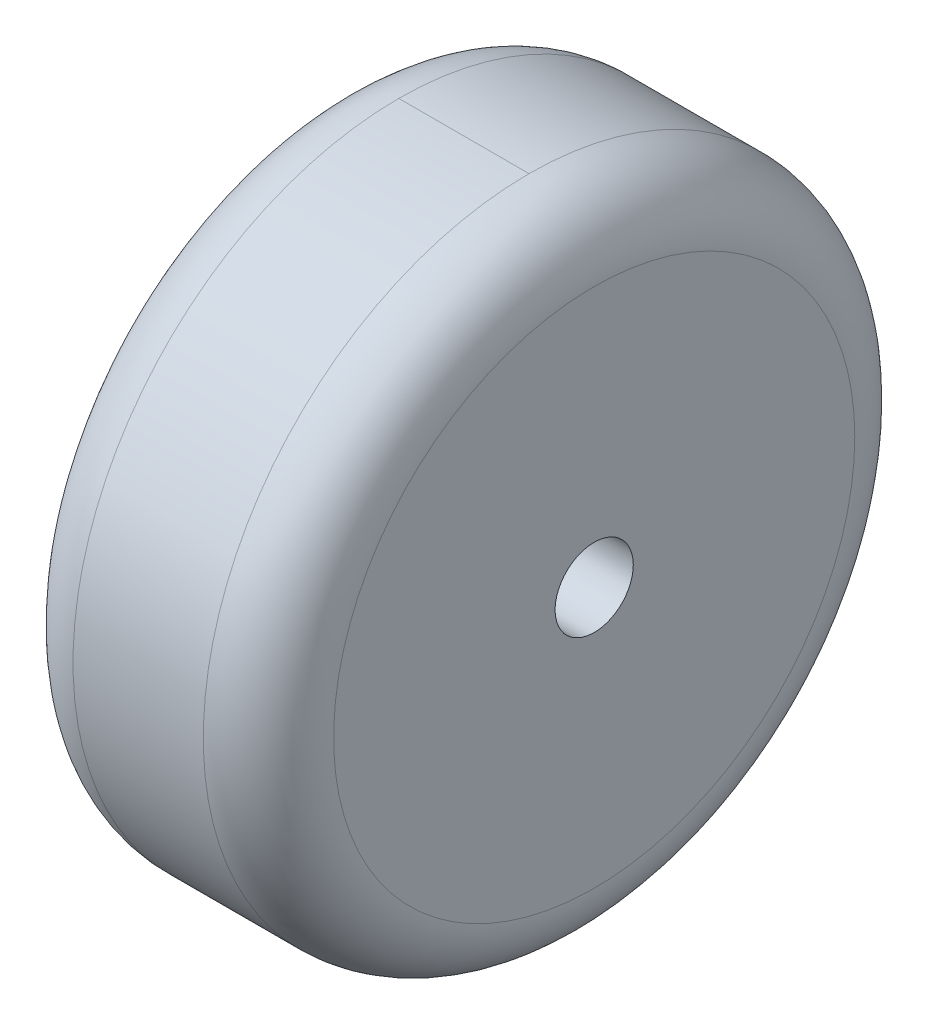
ISO-10303-21;
HEADER;
FILE_DESCRIPTION(('STEP AP214'),'2;1');
FILE_NAME('part.step','',(''),(''),'','','');
FILE_SCHEMA(('AUTOMOTIVE_DESIGN { 1 0 10303 214 1 1 1 1 }'));
ENDSEC;
DATA;
#1=APPLICATION_CONTEXT('core data for automotive mechanical design processes');
#2=APPLICATION_PROTOCOL_DEFINITION('international standard','automotive_design',2000,#1);
#3=PRODUCT_CONTEXT('',#1,'mechanical');
#4=PRODUCT('Part','Part','',(#3));
#5=PRODUCT_RELATED_PRODUCT_CATEGORY('part','',(#4));
#6=PRODUCT_DEFINITION_FORMATION('','',#4);
#7=PRODUCT_DEFINITION_CONTEXT('part definition',#1,'design');
#8=PRODUCT_DEFINITION('design','',#6,#7);
#9=PRODUCT_DEFINITION_SHAPE('','',#8);
#10=(LENGTH_UNIT() NAMED_UNIT(*) SI_UNIT(.MILLI.,.METRE.));
#11=(NAMED_UNIT(*) PLANE_ANGLE_UNIT() SI_UNIT($,.RADIAN.));
#12=(NAMED_UNIT(*) SI_UNIT($,.STERADIAN.) SOLID_ANGLE_UNIT());
#13=UNCERTAINTY_MEASURE_WITH_UNIT(LENGTH_MEASURE(1.E-05),#10,'distance_accuracy_value','');
#14=(GEOMETRIC_REPRESENTATION_CONTEXT(3) GLOBAL_UNCERTAINTY_ASSIGNED_CONTEXT((#13)) GLOBAL_UNIT_ASSIGNED_CONTEXT((#10,
#11,#12)) REPRESENTATION_CONTEXT('',''));
#15=CARTESIAN_POINT('',(0.,0.,0.));
#16=DIRECTION('',(0.,0.,1.));
#17=DIRECTION('',(1.,0.,0.));
#18=AXIS2_PLACEMENT_3D('',#15,#16,#17);
#19=CARTESIAN_POINT('',(10.,-52.9819696093251,284.712869435092));
#20=DIRECTION('',(-1.,0.,0.));
#21=DIRECTION('',(0.,0.,1.));
#22=AXIS2_PLACEMENT_3D('',#19,#20,#21);
#23=CYLINDRICAL_SURFACE('',#22,25.);
#24=CARTESIAN_POINT('',(-5.,-52.9819696093251,284.712869435092));
#25=DIRECTION('',(1.,0.,0.));
#26=DIRECTION('',(0.,0.,-1.));
#27=AXIS2_PLACEMENT_3D('',#24,#25,#26);
#28=CIRCLE('',#27,25.);
#29=CARTESIAN_POINT('',(-5.,-77.9819696093251,284.712869435092));
#30=VERTEX_POINT('',#29);
#31=CARTESIAN_POINT('',(-5.,-27.9819696093251,284.712869435092));
#32=VERTEX_POINT('',#31);
#33=EDGE_CURVE('E70',#30,#32,#28,.T.);
#34=ORIENTED_EDGE('',*,*,#33,.T.);
#35=DIRECTION('',(1.,0.,0.));
#36=VECTOR('',#35,1.);
#37=CARTESIAN_POINT('',(10.,-27.9819696093251,284.712869435092));
#38=LINE('',#37,#36);
#39=CARTESIAN_POINT('',(5.,-27.9819696093251,284.712869435092));
#40=VERTEX_POINT('',#39);
#41=EDGE_CURVE('E12',#32,#40,#38,.T.);
#42=ORIENTED_EDGE('',*,*,#41,.T.);
#43=CARTESIAN_POINT('',(5.,-52.9819696093251,284.712869435092));
#44=DIRECTION('',(1.,0.,0.));
#45=DIRECTION('',(0.,0.,-1.));
#46=AXIS2_PLACEMENT_3D('',#43,#44,#45);
#47=CIRCLE('',#46,25.);
#48=CARTESIAN_POINT('',(5.,-77.9819696093251,284.712869435092));
#49=VERTEX_POINT('',#48);
#50=EDGE_CURVE('E73',#40,#49,#47,.F.);
#51=ORIENTED_EDGE('',*,*,#50,.T.);
#52=DIRECTION('',(-1.,0.,0.));
#53=VECTOR('',#52,1.);
#54=CARTESIAN_POINT('',(10.,-77.9819696093251,284.712869435092));
#55=LINE('',#54,#53);
#56=EDGE_CURVE('E48',#49,#30,#55,.T.);
#57=ORIENTED_EDGE('',*,*,#56,.T.);
#58=EDGE_LOOP('',(#34,#42,#51,#57));
#59=FACE_BOUND('',#58,.T.);
#60=ADVANCED_FACE('F40',(#59),#23,.T.);
#61=ORIENTED_EDGE('',*,*,#41,.F.);
#62=EDGE_CURVE('E64',#32,#30,#28,.T.);
#63=ORIENTED_EDGE('',*,*,#62,.T.);
#64=ORIENTED_EDGE('',*,*,#56,.F.);
#65=EDGE_CURVE('E71',#49,#40,#47,.F.);
#66=ORIENTED_EDGE('',*,*,#65,.T.);
#67=EDGE_LOOP('',(#61,#63,#64,#66));
#68=FACE_BOUND('',#67,.T.);
#69=ADVANCED_FACE('F66',(#68),#23,.T.);
#70=CARTESIAN_POINT('',(10.,-52.9819696093251,284.712869435092));
#71=DIRECTION('',(1.,0.,0.));
#72=DIRECTION('',(0.,0.,-1.));
#73=AXIS2_PLACEMENT_3D('',#70,#71,#72);
#74=PLANE('',#73);
#75=CARTESIAN_POINT('',(10.,-52.9819696093251,284.712869435092));
#76=DIRECTION('',(1.,0.,0.));
#77=DIRECTION('',(0.,0.,-1.));
#78=AXIS2_PLACEMENT_3D('',#75,#76,#77);
#79=CIRCLE('',#78,2.99999999999999);
#80=CARTESIAN_POINT('',(10.,-52.9819696093251,281.712869435092));
#81=VERTEX_POINT('',#80);
#82=EDGE_CURVE('E86',#81,#81,#79,.T.);
#83=ORIENTED_EDGE('',*,*,#82,.F.);
#84=EDGE_LOOP('',(#83));
#85=FACE_BOUND('',#84,.T.);
#86=CARTESIAN_POINT('',(10.,-52.9819696093251,284.712869435092));
#87=DIRECTION('',(1.,0.,0.));
#88=DIRECTION('',(0.,0.,-1.));
#89=AXIS2_PLACEMENT_3D('',#86,#87,#88);
#90=CIRCLE('',#89,20.);
#91=CARTESIAN_POINT('',(10.,-52.9819696093251,264.712869435092));
#92=VERTEX_POINT('',#91);
#93=EDGE_CURVE('E74',#92,#92,#90,.T.);
#94=ORIENTED_EDGE('',*,*,#93,.T.);
#95=EDGE_LOOP('',(#94));
#96=FACE_BOUND('',#95,.T.);
#97=ADVANCED_FACE('F95',(#85,#96),#74,.T.);
#98=CARTESIAN_POINT('',(-10.,-52.9819696093251,284.712869435092));
#99=DIRECTION('',(1.,0.,0.));
#100=DIRECTION('',(0.,0.,-1.));
#101=AXIS2_PLACEMENT_3D('',#98,#99,#100);
#102=PLANE('',#101);
#103=CARTESIAN_POINT('',(-9.99999999999999,-52.9819696093251,284.712869435092));
#104=DIRECTION('',(1.,0.,0.));
#105=DIRECTION('',(0.,0.,-1.));
#106=AXIS2_PLACEMENT_3D('',#103,#104,#105);
#107=CIRCLE('',#106,2.99999999999999);
#108=CARTESIAN_POINT('',(-9.99999999999999,-52.9819696093251,281.712869435092));
#109=VERTEX_POINT('',#108);
#110=EDGE_CURVE('E84',#109,#109,#107,.T.);
#111=ORIENTED_EDGE('',*,*,#110,.T.);
#112=EDGE_LOOP('',(#111));
#113=FACE_BOUND('',#112,.T.);
#114=CARTESIAN_POINT('',(-10.,-52.9819696093251,284.712869435092));
#115=DIRECTION('',(1.,0.,0.));
#116=DIRECTION('',(0.,0.,-1.));
#117=AXIS2_PLACEMENT_3D('',#114,#115,#116);
#118=CIRCLE('',#117,20.);
#119=CARTESIAN_POINT('',(-10.,-52.9819696093251,264.712869435092));
#120=VERTEX_POINT('',#119);
#121=EDGE_CURVE('E76',#120,#120,#118,.F.);
#122=ORIENTED_EDGE('',*,*,#121,.T.);
#123=EDGE_LOOP('',(#122));
#124=FACE_BOUND('',#123,.T.);
#125=ADVANCED_FACE('F98',(#113,#124),#102,.F.);
#126=CARTESIAN_POINT('',(-5.,-52.9819696093251,284.712869435092));
#127=DIRECTION('',(1.,0.,0.));
#128=DIRECTION('',(0.,0.,-1.));
#129=AXIS2_PLACEMENT_3D('',#126,#127,#128);
#130=TOROIDAL_SURFACE('',#129,20.,5.);
#131=ORIENTED_EDGE('',*,*,#121,.F.);
#132=EDGE_LOOP('',(#131));
#133=FACE_BOUND('',#132,.T.);
#134=ORIENTED_EDGE('',*,*,#33,.F.);
#135=ORIENTED_EDGE('',*,*,#62,.F.);
#136=EDGE_LOOP('',(#134,#135));
#137=FACE_BOUND('',#136,.T.);
#138=ADVANCED_FACE('F75',(#133,#137),#130,.T.);
#139=CARTESIAN_POINT('',(5.,-52.9819696093251,284.712869435092));
#140=DIRECTION('',(1.,0.,0.));
#141=DIRECTION('',(0.,0.,-1.));
#142=AXIS2_PLACEMENT_3D('',#139,#140,#141);
#143=TOROIDAL_SURFACE('',#142,20.,5.);
#144=ORIENTED_EDGE('',*,*,#65,.F.);
#145=ORIENTED_EDGE('',*,*,#50,.F.);
#146=EDGE_LOOP('',(#144,#145));
#147=FACE_BOUND('',#146,.T.);
#148=ORIENTED_EDGE('',*,*,#93,.F.);
#149=EDGE_LOOP('',(#148));
#150=FACE_BOUND('',#149,.T.);
#151=ADVANCED_FACE('F42',(#147,#150),#143,.T.);
#152=CARTESIAN_POINT('',(-90.,-52.9819696093251,284.712869435092));
#153=DIRECTION('',(1.,0.,0.));
#154=DIRECTION('',(0.,0.,-1.));
#155=AXIS2_PLACEMENT_3D('',#152,#153,#154);
#156=CYLINDRICAL_SURFACE('',#155,2.99999999999999);
#157=ORIENTED_EDGE('',*,*,#82,.T.);
#158=EDGE_LOOP('',(#157));
#159=FACE_BOUND('',#158,.T.);
#160=ORIENTED_EDGE('',*,*,#110,.F.);
#161=EDGE_LOOP('',(#160));
#162=FACE_BOUND('',#161,.T.);
#163=ADVANCED_FACE('F92',(#159,#162),#156,.F.);
#164=CLOSED_SHELL('',(#60,#69,#97,#125,#138,#151,#163));
#165=MANIFOLD_SOLID_BREP('B2',#164);
#166=ADVANCED_BREP_SHAPE_REPRESENTATION('',(#18,#165),#14);
#167=SHAPE_DEFINITION_REPRESENTATION(#9,#166);
ENDSEC;
END-ISO-10303-21;
